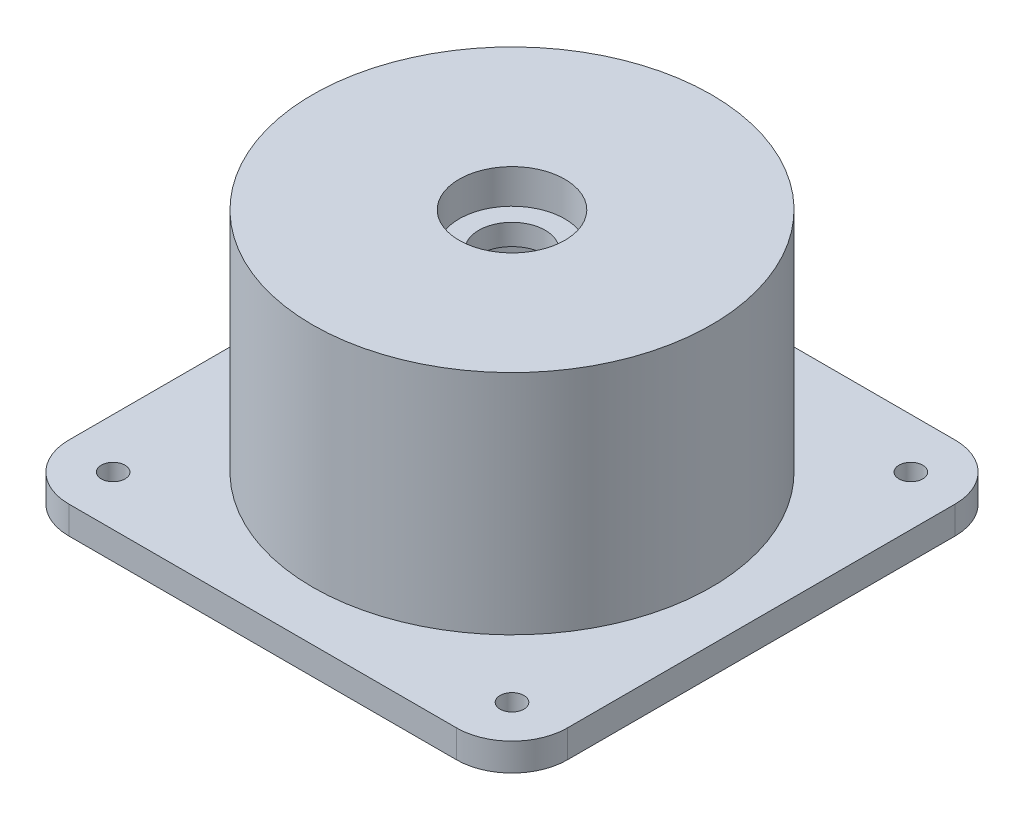
ISO-10303-21;
HEADER;
FILE_DESCRIPTION(('STEP AP214'),'2;1');
FILE_NAME('part.step','',(''),(''),'','','');
FILE_SCHEMA(('AUTOMOTIVE_DESIGN { 1 0 10303 214 1 1 1 1 }'));
ENDSEC;
DATA;
#1=APPLICATION_CONTEXT('core data for automotive mechanical design processes');
#2=APPLICATION_PROTOCOL_DEFINITION('international standard','automotive_design',2000,#1);
#3=PRODUCT_CONTEXT('',#1,'mechanical');
#4=PRODUCT('Part','Part','',(#3));
#5=PRODUCT_RELATED_PRODUCT_CATEGORY('part','',(#4));
#6=PRODUCT_DEFINITION_FORMATION('','',#4);
#7=PRODUCT_DEFINITION_CONTEXT('part definition',#1,'design');
#8=PRODUCT_DEFINITION('design','',#6,#7);
#9=PRODUCT_DEFINITION_SHAPE('','',#8);
#10=(LENGTH_UNIT() NAMED_UNIT(*) SI_UNIT(.MILLI.,.METRE.));
#11=(NAMED_UNIT(*) PLANE_ANGLE_UNIT() SI_UNIT($,.RADIAN.));
#12=(NAMED_UNIT(*) SI_UNIT($,.STERADIAN.) SOLID_ANGLE_UNIT());
#13=UNCERTAINTY_MEASURE_WITH_UNIT(LENGTH_MEASURE(1.E-05),#10,'distance_accuracy_value','');
#14=(GEOMETRIC_REPRESENTATION_CONTEXT(3) GLOBAL_UNCERTAINTY_ASSIGNED_CONTEXT((#13)) GLOBAL_UNIT_ASSIGNED_CONTEXT((#10,
#11,#12)) REPRESENTATION_CONTEXT('',''));
#15=CARTESIAN_POINT('',(0.,0.,0.));
#16=DIRECTION('',(0.,0.,1.));
#17=DIRECTION('',(1.,0.,0.));
#18=AXIS2_PLACEMENT_3D('',#15,#16,#17);
#19=CARTESIAN_POINT('',(-35.,5.,35.));
#20=DIRECTION('',(0.,-1.,0.));
#21=DIRECTION('',(0.,0.,-1.));
#22=AXIS2_PLACEMENT_3D('',#19,#20,#21);
#23=PLANE('',#22);
#24=CARTESIAN_POINT('',(0.,5.,0.));
#25=DIRECTION('',(0.,1.,0.));
#26=DIRECTION('',(0.,0.,1.));
#27=AXIS2_PLACEMENT_3D('',#24,#25,#26);
#28=CIRCLE('',#27,36.);
#29=CARTESIAN_POINT('',(0.,5.,36.));
#30=VERTEX_POINT('',#29);
#31=EDGE_CURVE('E11',#30,#30,#28,.T.);
#32=ORIENTED_EDGE('',*,*,#31,.F.);
#33=EDGE_LOOP('',(#32));
#34=FACE_BOUND('',#33,.T.);
#35=CARTESIAN_POINT('',(-35.,5.,35.));
#36=DIRECTION('',(0.,1.,0.));
#37=DIRECTION('',(0.,0.,-1.));
#38=AXIS2_PLACEMENT_3D('',#35,#36,#37);
#39=CIRCLE('',#38,10.);
#40=CARTESIAN_POINT('',(-45.,5.,35.));
#41=VERTEX_POINT('',#40);
#42=CARTESIAN_POINT('',(-35.,5.,45.));
#43=VERTEX_POINT('',#42);
#44=EDGE_CURVE('E174',#41,#43,#39,.T.);
#45=ORIENTED_EDGE('',*,*,#44,.T.);
#46=DIRECTION('',(1.,0.,0.));
#47=VECTOR('',#46,1.);
#48=CARTESIAN_POINT('',(-35.,5.,45.));
#49=LINE('',#48,#47);
#50=CARTESIAN_POINT('',(35.,5.,45.));
#51=VERTEX_POINT('',#50);
#52=EDGE_CURVE('E107',#43,#51,#49,.T.);
#53=ORIENTED_EDGE('',*,*,#52,.T.);
#54=CARTESIAN_POINT('',(35.,5.,35.));
#55=DIRECTION('',(0.,1.,0.));
#56=DIRECTION('',(0.,0.,1.));
#57=AXIS2_PLACEMENT_3D('',#54,#55,#56);
#58=CIRCLE('',#57,9.99999999999999);
#59=CARTESIAN_POINT('',(45.,5.,35.));
#60=VERTEX_POINT('',#59);
#61=EDGE_CURVE('E215',#51,#60,#58,.T.);
#62=ORIENTED_EDGE('',*,*,#61,.T.);
#63=DIRECTION('',(0.,0.,-1.));
#64=VECTOR('',#63,1.);
#65=CARTESIAN_POINT('',(45.,5.,-35.));
#66=LINE('',#65,#64);
#67=CARTESIAN_POINT('',(45.,5.,-35.));
#68=VERTEX_POINT('',#67);
#69=EDGE_CURVE('E209',#60,#68,#66,.T.);
#70=ORIENTED_EDGE('',*,*,#69,.T.);
#71=CARTESIAN_POINT('',(35.,5.,-35.));
#72=DIRECTION('',(0.,1.,0.));
#73=DIRECTION('',(0.,0.,-1.));
#74=AXIS2_PLACEMENT_3D('',#71,#72,#73);
#75=CIRCLE('',#74,10.);
#76=CARTESIAN_POINT('',(35.,5.,-45.));
#77=VERTEX_POINT('',#76);
#78=EDGE_CURVE('E130',#68,#77,#75,.T.);
#79=ORIENTED_EDGE('',*,*,#78,.T.);
#80=DIRECTION('',(-1.,0.,0.));
#81=VECTOR('',#80,1.);
#82=CARTESIAN_POINT('',(-35.,5.,-45.));
#83=LINE('',#82,#81);
#84=CARTESIAN_POINT('',(-35.,5.,-45.));
#85=VERTEX_POINT('',#84);
#86=EDGE_CURVE('E124',#77,#85,#83,.T.);
#87=ORIENTED_EDGE('',*,*,#86,.T.);
#88=CARTESIAN_POINT('',(-35.,5.,-35.));
#89=DIRECTION('',(0.,1.,0.));
#90=DIRECTION('',(0.,0.,1.));
#91=AXIS2_PLACEMENT_3D('',#88,#89,#90);
#92=CIRCLE('',#91,10.);
#93=CARTESIAN_POINT('',(-45.,5.,-35.));
#94=VERTEX_POINT('',#93);
#95=EDGE_CURVE('E122',#85,#94,#92,.T.);
#96=ORIENTED_EDGE('',*,*,#95,.T.);
#97=DIRECTION('',(0.,0.,1.));
#98=VECTOR('',#97,1.);
#99=CARTESIAN_POINT('',(-45.,5.,-35.));
#100=LINE('',#99,#98);
#101=EDGE_CURVE('E65',#94,#41,#100,.T.);
#102=ORIENTED_EDGE('',*,*,#101,.T.);
#103=EDGE_LOOP('',(#45,#53,#62,#70,#79,#87,#96,#102));
#104=FACE_BOUND('',#103,.T.);
#105=CARTESIAN_POINT('',(-36.,5.,-36.));
#106=DIRECTION('',(0.,1.,0.));
#107=DIRECTION('',(0.,0.,1.));
#108=AXIS2_PLACEMENT_3D('',#105,#106,#107);
#109=CIRCLE('',#108,2.15);
#110=CARTESIAN_POINT('',(-36.,5.,-33.85));
#111=VERTEX_POINT('',#110);
#112=EDGE_CURVE('E152',#111,#111,#109,.T.);
#113=ORIENTED_EDGE('',*,*,#112,.F.);
#114=EDGE_LOOP('',(#113));
#115=FACE_BOUND('',#114,.T.);
#116=CARTESIAN_POINT('',(36.,5.,-36.));
#117=DIRECTION('',(0.,1.,0.));
#118=DIRECTION('',(0.,0.,1.));
#119=AXIS2_PLACEMENT_3D('',#116,#117,#118);
#120=CIRCLE('',#119,2.15);
#121=CARTESIAN_POINT('',(36.,5.,-33.85));
#122=VERTEX_POINT('',#121);
#123=EDGE_CURVE('E228',#122,#122,#120,.T.);
#124=ORIENTED_EDGE('',*,*,#123,.F.);
#125=EDGE_LOOP('',(#124));
#126=FACE_BOUND('',#125,.T.);
#127=CARTESIAN_POINT('',(36.,5.,36.));
#128=DIRECTION('',(0.,1.,0.));
#129=DIRECTION('',(0.,0.,1.));
#130=AXIS2_PLACEMENT_3D('',#127,#128,#129);
#131=CIRCLE('',#130,2.15);
#132=CARTESIAN_POINT('',(36.,5.,38.15));
#133=VERTEX_POINT('',#132);
#134=EDGE_CURVE('E233',#133,#133,#131,.T.);
#135=ORIENTED_EDGE('',*,*,#134,.F.);
#136=EDGE_LOOP('',(#135));
#137=FACE_BOUND('',#136,.T.);
#138=CARTESIAN_POINT('',(-36.,5.,36.));
#139=DIRECTION('',(0.,1.,0.));
#140=DIRECTION('',(0.,0.,1.));
#141=AXIS2_PLACEMENT_3D('',#138,#139,#140);
#142=CIRCLE('',#141,2.15);
#143=CARTESIAN_POINT('',(-36.,5.,38.15));
#144=VERTEX_POINT('',#143);
#145=EDGE_CURVE('E244',#144,#144,#142,.T.);
#146=ORIENTED_EDGE('',*,*,#145,.F.);
#147=EDGE_LOOP('',(#146));
#148=FACE_BOUND('',#147,.T.);
#149=ADVANCED_FACE('F42',(#34,#104,#115,#126,#137,#148),#23,.F.);
#150=CARTESIAN_POINT('',(-35.,0.,35.));
#151=DIRECTION('',(0.,-1.,0.));
#152=DIRECTION('',(0.,0.,-1.));
#153=AXIS2_PLACEMENT_3D('',#150,#151,#152);
#154=PLANE('',#153);
#155=CARTESIAN_POINT('',(0.,0.,0.));
#156=DIRECTION('',(0.,-1.,0.));
#157=DIRECTION('',(0.,0.,-1.));
#158=AXIS2_PLACEMENT_3D('',#155,#156,#157);
#159=CIRCLE('',#158,32.);
#160=CARTESIAN_POINT('',(0.,0.,-32.));
#161=VERTEX_POINT('',#160);
#162=EDGE_CURVE('E266',#161,#161,#159,.T.);
#163=ORIENTED_EDGE('',*,*,#162,.F.);
#164=EDGE_LOOP('',(#163));
#165=FACE_BOUND('',#164,.T.);
#166=CARTESIAN_POINT('',(36.,0.,36.));
#167=DIRECTION('',(0.,1.,0.));
#168=DIRECTION('',(0.,0.,1.));
#169=AXIS2_PLACEMENT_3D('',#166,#167,#168);
#170=CIRCLE('',#169,2.15);
#171=CARTESIAN_POINT('',(36.,0.,38.15));
#172=VERTEX_POINT('',#171);
#173=EDGE_CURVE('E236',#172,#172,#170,.T.);
#174=ORIENTED_EDGE('',*,*,#173,.T.);
#175=EDGE_LOOP('',(#174));
#176=FACE_BOUND('',#175,.T.);
#177=CARTESIAN_POINT('',(-36.,0.,-36.));
#178=DIRECTION('',(0.,1.,0.));
#179=DIRECTION('',(0.,0.,1.));
#180=AXIS2_PLACEMENT_3D('',#177,#178,#179);
#181=CIRCLE('',#180,2.15);
#182=CARTESIAN_POINT('',(-36.,0.,-33.85));
#183=VERTEX_POINT('',#182);
#184=EDGE_CURVE('E225',#183,#183,#181,.T.);
#185=ORIENTED_EDGE('',*,*,#184,.T.);
#186=EDGE_LOOP('',(#185));
#187=FACE_BOUND('',#186,.T.);
#188=CARTESIAN_POINT('',(-35.,0.,35.));
#189=DIRECTION('',(0.,1.,0.));
#190=DIRECTION('',(0.,0.,-1.));
#191=AXIS2_PLACEMENT_3D('',#188,#189,#190);
#192=CIRCLE('',#191,10.);
#193=CARTESIAN_POINT('',(-45.,0.,35.));
#194=VERTEX_POINT('',#193);
#195=CARTESIAN_POINT('',(-35.,0.,45.));
#196=VERTEX_POINT('',#195);
#197=EDGE_CURVE('E149',#194,#196,#192,.T.);
#198=ORIENTED_EDGE('',*,*,#197,.F.);
#199=DIRECTION('',(0.,0.,1.));
#200=VECTOR('',#199,1.);
#201=CARTESIAN_POINT('',(-45.,0.,-35.));
#202=LINE('',#201,#200);
#203=CARTESIAN_POINT('',(-45.,0.,-35.));
#204=VERTEX_POINT('',#203);
#205=EDGE_CURVE('E97',#204,#194,#202,.T.);
#206=ORIENTED_EDGE('',*,*,#205,.F.);
#207=CARTESIAN_POINT('',(-35.,0.,-35.));
#208=DIRECTION('',(0.,1.,0.));
#209=DIRECTION('',(0.,0.,1.));
#210=AXIS2_PLACEMENT_3D('',#207,#208,#209);
#211=CIRCLE('',#210,10.);
#212=CARTESIAN_POINT('',(-35.,0.,-45.));
#213=VERTEX_POINT('',#212);
#214=EDGE_CURVE('E91',#213,#204,#211,.T.);
#215=ORIENTED_EDGE('',*,*,#214,.F.);
#216=DIRECTION('',(-1.,0.,0.));
#217=VECTOR('',#216,1.);
#218=CARTESIAN_POINT('',(-35.,0.,-45.));
#219=LINE('',#218,#217);
#220=CARTESIAN_POINT('',(35.,0.,-45.));
#221=VERTEX_POINT('',#220);
#222=EDGE_CURVE('E139',#221,#213,#219,.T.);
#223=ORIENTED_EDGE('',*,*,#222,.F.);
#224=CARTESIAN_POINT('',(35.,0.,-35.));
#225=DIRECTION('',(0.,1.,0.));
#226=DIRECTION('',(0.,0.,-1.));
#227=AXIS2_PLACEMENT_3D('',#224,#225,#226);
#228=CIRCLE('',#227,10.);
#229=CARTESIAN_POINT('',(45.,0.,-35.));
#230=VERTEX_POINT('',#229);
#231=EDGE_CURVE('E162',#230,#221,#228,.T.);
#232=ORIENTED_EDGE('',*,*,#231,.F.);
#233=DIRECTION('',(0.,0.,-1.));
#234=VECTOR('',#233,1.);
#235=CARTESIAN_POINT('',(45.,0.,-35.));
#236=LINE('',#235,#234);
#237=CARTESIAN_POINT('',(45.,0.,35.));
#238=VERTEX_POINT('',#237);
#239=EDGE_CURVE('E159',#238,#230,#236,.T.);
#240=ORIENTED_EDGE('',*,*,#239,.F.);
#241=CARTESIAN_POINT('',(35.,0.,35.));
#242=DIRECTION('',(0.,1.,0.));
#243=DIRECTION('',(0.,0.,1.));
#244=AXIS2_PLACEMENT_3D('',#241,#242,#243);
#245=CIRCLE('',#244,9.99999999999999);
#246=CARTESIAN_POINT('',(35.,0.,45.));
#247=VERTEX_POINT('',#246);
#248=EDGE_CURVE('E160',#247,#238,#245,.T.);
#249=ORIENTED_EDGE('',*,*,#248,.F.);
#250=DIRECTION('',(1.,0.,0.));
#251=VECTOR('',#250,1.);
#252=CARTESIAN_POINT('',(-35.,0.,45.));
#253=LINE('',#252,#251);
#254=EDGE_CURVE('E153',#196,#247,#253,.T.);
#255=ORIENTED_EDGE('',*,*,#254,.F.);
#256=EDGE_LOOP('',(#198,#206,#215,#223,#232,#240,#249,#255));
#257=FACE_BOUND('',#256,.T.);
#258=CARTESIAN_POINT('',(36.,0.,-36.));
#259=DIRECTION('',(0.,1.,0.));
#260=DIRECTION('',(0.,0.,1.));
#261=AXIS2_PLACEMENT_3D('',#258,#259,#260);
#262=CIRCLE('',#261,2.15);
#263=CARTESIAN_POINT('',(36.,0.,-33.85));
#264=VERTEX_POINT('',#263);
#265=EDGE_CURVE('E226',#264,#264,#262,.T.);
#266=ORIENTED_EDGE('',*,*,#265,.T.);
#267=EDGE_LOOP('',(#266));
#268=FACE_BOUND('',#267,.T.);
#269=CARTESIAN_POINT('',(-36.,0.,36.));
#270=DIRECTION('',(0.,1.,0.));
#271=DIRECTION('',(0.,0.,1.));
#272=AXIS2_PLACEMENT_3D('',#269,#270,#271);
#273=CIRCLE('',#272,2.15);
#274=CARTESIAN_POINT('',(-36.,0.,38.15));
#275=VERTEX_POINT('',#274);
#276=EDGE_CURVE('E249',#275,#275,#273,.T.);
#277=ORIENTED_EDGE('',*,*,#276,.T.);
#278=EDGE_LOOP('',(#277));
#279=FACE_BOUND('',#278,.T.);
#280=ADVANCED_FACE('F197',(#165,#176,#187,#257,#268,#279),#154,.T.);
#281=CARTESIAN_POINT('',(-35.,5.,35.));
#282=DIRECTION('',(0.,-1.,0.));
#283=DIRECTION('',(0.,0.,-1.));
#284=AXIS2_PLACEMENT_3D('',#281,#282,#283);
#285=CYLINDRICAL_SURFACE('',#284,10.);
#286=ORIENTED_EDGE('',*,*,#197,.T.);
#287=DIRECTION('',(0.,-1.,0.));
#288=VECTOR('',#287,1.);
#289=CARTESIAN_POINT('',(-35.,5.,45.));
#290=LINE('',#289,#288);
#291=EDGE_CURVE('E54',#43,#196,#290,.T.);
#292=ORIENTED_EDGE('',*,*,#291,.F.);
#293=ORIENTED_EDGE('',*,*,#44,.F.);
#294=DIRECTION('',(0.,-1.,0.));
#295=VECTOR('',#294,1.);
#296=CARTESIAN_POINT('',(-45.,5.,35.));
#297=LINE('',#296,#295);
#298=EDGE_CURVE('E144',#41,#194,#297,.T.);
#299=ORIENTED_EDGE('',*,*,#298,.T.);
#300=EDGE_LOOP('',(#286,#292,#293,#299));
#301=FACE_BOUND('',#300,.T.);
#302=ADVANCED_FACE('F46',(#301),#285,.T.);
#303=CARTESIAN_POINT('',(-35.,5.,45.));
#304=DIRECTION('',(0.,0.,-1.));
#305=DIRECTION('',(-1.,0.,0.));
#306=AXIS2_PLACEMENT_3D('',#303,#304,#305);
#307=PLANE('',#306);
#308=ORIENTED_EDGE('',*,*,#254,.T.);
#309=DIRECTION('',(0.,-1.,0.));
#310=VECTOR('',#309,1.);
#311=CARTESIAN_POINT('',(35.,5.,45.));
#312=LINE('',#311,#310);
#313=EDGE_CURVE('E189',#51,#247,#312,.T.);
#314=ORIENTED_EDGE('',*,*,#313,.F.);
#315=ORIENTED_EDGE('',*,*,#52,.F.);
#316=ORIENTED_EDGE('',*,*,#291,.T.);
#317=EDGE_LOOP('',(#308,#314,#315,#316));
#318=FACE_BOUND('',#317,.T.);
#319=ADVANCED_FACE('F191',(#318),#307,.F.);
#320=CARTESIAN_POINT('',(35.,5.,35.));
#321=DIRECTION('',(0.,-1.,0.));
#322=DIRECTION('',(0.,0.,-1.));
#323=AXIS2_PLACEMENT_3D('',#320,#321,#322);
#324=CYLINDRICAL_SURFACE('',#323,9.99999999999999);
#325=ORIENTED_EDGE('',*,*,#248,.T.);
#326=DIRECTION('',(0.,-1.,0.));
#327=VECTOR('',#326,1.);
#328=CARTESIAN_POINT('',(45.,5.,35.));
#329=LINE('',#328,#327);
#330=EDGE_CURVE('E181',#60,#238,#329,.T.);
#331=ORIENTED_EDGE('',*,*,#330,.F.);
#332=ORIENTED_EDGE('',*,*,#61,.F.);
#333=ORIENTED_EDGE('',*,*,#313,.T.);
#334=EDGE_LOOP('',(#325,#331,#332,#333));
#335=FACE_BOUND('',#334,.T.);
#336=ADVANCED_FACE('F204',(#335),#324,.T.);
#337=CARTESIAN_POINT('',(45.,5.,-35.));
#338=DIRECTION('',(-1.,0.,0.));
#339=DIRECTION('',(0.,0.,1.));
#340=AXIS2_PLACEMENT_3D('',#337,#338,#339);
#341=PLANE('',#340);
#342=ORIENTED_EDGE('',*,*,#239,.T.);
#343=DIRECTION('',(0.,-1.,0.));
#344=VECTOR('',#343,1.);
#345=CARTESIAN_POINT('',(45.,5.,-35.));
#346=LINE('',#345,#344);
#347=EDGE_CURVE('E178',#68,#230,#346,.T.);
#348=ORIENTED_EDGE('',*,*,#347,.F.);
#349=ORIENTED_EDGE('',*,*,#69,.F.);
#350=ORIENTED_EDGE('',*,*,#330,.T.);
#351=EDGE_LOOP('',(#342,#348,#349,#350));
#352=FACE_BOUND('',#351,.T.);
#353=ADVANCED_FACE('F208',(#352),#341,.F.);
#354=CARTESIAN_POINT('',(35.,5.,-35.));
#355=DIRECTION('',(0.,-1.,0.));
#356=DIRECTION('',(0.,0.,-1.));
#357=AXIS2_PLACEMENT_3D('',#354,#355,#356);
#358=CYLINDRICAL_SURFACE('',#357,10.);
#359=ORIENTED_EDGE('',*,*,#231,.T.);
#360=DIRECTION('',(0.,-1.,0.));
#361=VECTOR('',#360,1.);
#362=CARTESIAN_POINT('',(35.,5.,-45.));
#363=LINE('',#362,#361);
#364=EDGE_CURVE('E140',#77,#221,#363,.T.);
#365=ORIENTED_EDGE('',*,*,#364,.F.);
#366=ORIENTED_EDGE('',*,*,#78,.F.);
#367=ORIENTED_EDGE('',*,*,#347,.T.);
#368=EDGE_LOOP('',(#359,#365,#366,#367));
#369=FACE_BOUND('',#368,.T.);
#370=ADVANCED_FACE('F332',(#369),#358,.T.);
#371=CARTESIAN_POINT('',(-35.,5.,-45.));
#372=DIRECTION('',(0.,0.,1.));
#373=DIRECTION('',(1.,0.,0.));
#374=AXIS2_PLACEMENT_3D('',#371,#372,#373);
#375=PLANE('',#374);
#376=ORIENTED_EDGE('',*,*,#222,.T.);
#377=DIRECTION('',(0.,-1.,0.));
#378=VECTOR('',#377,1.);
#379=CARTESIAN_POINT('',(-35.,5.,-45.));
#380=LINE('',#379,#378);
#381=EDGE_CURVE('E132',#85,#213,#380,.T.);
#382=ORIENTED_EDGE('',*,*,#381,.F.);
#383=ORIENTED_EDGE('',*,*,#86,.F.);
#384=ORIENTED_EDGE('',*,*,#364,.T.);
#385=EDGE_LOOP('',(#376,#382,#383,#384));
#386=FACE_BOUND('',#385,.T.);
#387=ADVANCED_FACE('F135',(#386),#375,.F.);
#388=CARTESIAN_POINT('',(-35.,5.,-35.));
#389=DIRECTION('',(0.,-1.,0.));
#390=DIRECTION('',(0.,0.,-1.));
#391=AXIS2_PLACEMENT_3D('',#388,#389,#390);
#392=CYLINDRICAL_SURFACE('',#391,10.);
#393=ORIENTED_EDGE('',*,*,#214,.T.);
#394=DIRECTION('',(0.,-1.,0.));
#395=VECTOR('',#394,1.);
#396=CARTESIAN_POINT('',(-45.,5.,-35.));
#397=LINE('',#396,#395);
#398=EDGE_CURVE('E138',#94,#204,#397,.T.);
#399=ORIENTED_EDGE('',*,*,#398,.F.);
#400=ORIENTED_EDGE('',*,*,#95,.F.);
#401=ORIENTED_EDGE('',*,*,#381,.T.);
#402=EDGE_LOOP('',(#393,#399,#400,#401));
#403=FACE_BOUND('',#402,.T.);
#404=ADVANCED_FACE('F143',(#403),#392,.T.);
#405=CARTESIAN_POINT('',(-45.,5.,-35.));
#406=DIRECTION('',(1.,0.,0.));
#407=DIRECTION('',(0.,0.,-1.));
#408=AXIS2_PLACEMENT_3D('',#405,#406,#407);
#409=PLANE('',#408);
#410=ORIENTED_EDGE('',*,*,#205,.T.);
#411=ORIENTED_EDGE('',*,*,#298,.F.);
#412=ORIENTED_EDGE('',*,*,#101,.F.);
#413=ORIENTED_EDGE('',*,*,#398,.T.);
#414=EDGE_LOOP('',(#410,#411,#412,#413));
#415=FACE_BOUND('',#414,.T.);
#416=ADVANCED_FACE('F307',(#415),#409,.F.);
#417=CARTESIAN_POINT('',(-36.,5.,-36.));
#418=DIRECTION('',(0.,-1.,0.));
#419=DIRECTION('',(0.,0.,-1.));
#420=AXIS2_PLACEMENT_3D('',#417,#418,#419);
#421=CYLINDRICAL_SURFACE('',#420,2.15);
#422=ORIENTED_EDGE('',*,*,#112,.T.);
#423=EDGE_LOOP('',(#422));
#424=FACE_BOUND('',#423,.T.);
#425=ORIENTED_EDGE('',*,*,#184,.F.);
#426=EDGE_LOOP('',(#425));
#427=FACE_BOUND('',#426,.T.);
#428=ADVANCED_FACE('F303',(#424,#427),#421,.F.);
#429=CARTESIAN_POINT('',(36.,5.,-36.));
#430=DIRECTION('',(0.,-1.,0.));
#431=DIRECTION('',(0.,0.,-1.));
#432=AXIS2_PLACEMENT_3D('',#429,#430,#431);
#433=CYLINDRICAL_SURFACE('',#432,2.15);
#434=ORIENTED_EDGE('',*,*,#123,.T.);
#435=EDGE_LOOP('',(#434));
#436=FACE_BOUND('',#435,.T.);
#437=ORIENTED_EDGE('',*,*,#265,.F.);
#438=EDGE_LOOP('',(#437));
#439=FACE_BOUND('',#438,.T.);
#440=ADVANCED_FACE('F308',(#436,#439),#433,.F.);
#441=CARTESIAN_POINT('',(36.,5.,36.));
#442=DIRECTION('',(0.,-1.,0.));
#443=DIRECTION('',(0.,0.,-1.));
#444=AXIS2_PLACEMENT_3D('',#441,#442,#443);
#445=CYLINDRICAL_SURFACE('',#444,2.15);
#446=ORIENTED_EDGE('',*,*,#134,.T.);
#447=EDGE_LOOP('',(#446));
#448=FACE_BOUND('',#447,.T.);
#449=ORIENTED_EDGE('',*,*,#173,.F.);
#450=EDGE_LOOP('',(#449));
#451=FACE_BOUND('',#450,.T.);
#452=ADVANCED_FACE('F314',(#448,#451),#445,.F.);
#453=CARTESIAN_POINT('',(-36.,5.,36.));
#454=DIRECTION('',(0.,-1.,0.));
#455=DIRECTION('',(0.,0.,-1.));
#456=AXIS2_PLACEMENT_3D('',#453,#454,#455);
#457=CYLINDRICAL_SURFACE('',#456,2.15);
#458=ORIENTED_EDGE('',*,*,#145,.T.);
#459=EDGE_LOOP('',(#458));
#460=FACE_BOUND('',#459,.T.);
#461=ORIENTED_EDGE('',*,*,#276,.F.);
#462=EDGE_LOOP('',(#461));
#463=FACE_BOUND('',#462,.T.);
#464=ADVANCED_FACE('F407',(#460,#463),#457,.F.);
#465=CARTESIAN_POINT('',(0.,46.,0.));
#466=DIRECTION('',(0.,-1.,0.));
#467=DIRECTION('',(0.,0.,-1.));
#468=AXIS2_PLACEMENT_3D('',#465,#466,#467);
#469=CYLINDRICAL_SURFACE('',#468,36.);
#470=CARTESIAN_POINT('',(0.,46.,0.));
#471=DIRECTION('',(0.,1.,0.));
#472=DIRECTION('',(0.,0.,1.));
#473=AXIS2_PLACEMENT_3D('',#470,#471,#472);
#474=CIRCLE('',#473,36.);
#475=CARTESIAN_POINT('',(0.,46.,36.));
#476=VERTEX_POINT('',#475);
#477=EDGE_CURVE('E247',#476,#476,#474,.T.);
#478=ORIENTED_EDGE('',*,*,#477,.F.);
#479=EDGE_LOOP('',(#478));
#480=FACE_BOUND('',#479,.T.);
#481=ORIENTED_EDGE('',*,*,#31,.T.);
#482=EDGE_LOOP('',(#481));
#483=FACE_BOUND('',#482,.T.);
#484=ADVANCED_FACE('F417',(#480,#483),#469,.T.);
#485=CARTESIAN_POINT('',(0.,46.,0.));
#486=DIRECTION('',(0.,1.,0.));
#487=DIRECTION('',(0.,0.,1.));
#488=AXIS2_PLACEMENT_3D('',#485,#486,#487);
#489=PLANE('',#488);
#490=CARTESIAN_POINT('',(0.,46.,0.));
#491=DIRECTION('',(0.,1.,0.));
#492=DIRECTION('',(0.,0.,1.));
#493=AXIS2_PLACEMENT_3D('',#490,#491,#492);
#494=CIRCLE('',#493,9.55);
#495=CARTESIAN_POINT('',(0.,46.,9.55));
#496=VERTEX_POINT('',#495);
#497=EDGE_CURVE('E256',#496,#496,#494,.T.);
#498=ORIENTED_EDGE('',*,*,#497,.F.);
#499=EDGE_LOOP('',(#498));
#500=FACE_BOUND('',#499,.T.);
#501=ORIENTED_EDGE('',*,*,#477,.T.);
#502=EDGE_LOOP('',(#501));
#503=FACE_BOUND('',#502,.T.);
#504=ADVANCED_FACE('F426',(#500,#503),#489,.T.);
#505=CARTESIAN_POINT('',(0.,39.8,0.));
#506=DIRECTION('',(0.,1.,0.));
#507=DIRECTION('',(0.,0.,1.));
#508=AXIS2_PLACEMENT_3D('',#505,#506,#507);
#509=CYLINDRICAL_SURFACE('',#508,9.55);
#510=CARTESIAN_POINT('',(0.,39.8,0.));
#511=DIRECTION('',(0.,1.,0.));
#512=DIRECTION('',(0.,0.,1.));
#513=AXIS2_PLACEMENT_3D('',#510,#511,#512);
#514=CIRCLE('',#513,9.55);
#515=CARTESIAN_POINT('',(0.,39.8,9.55));
#516=VERTEX_POINT('',#515);
#517=EDGE_CURVE('E260',#516,#516,#514,.T.);
#518=CARTESIAN_POINT('',(0.,39.8,9.55));
#519=CARTESIAN_POINT('',(0.,39.8645833333333,9.55));
#520=CARTESIAN_POINT('',(0.,39.9291666666667,9.55));
#521=CARTESIAN_POINT('',(0.,40.0583333333333,9.55));
#522=CARTESIAN_POINT('',(0.,40.1229166666667,9.55));
#523=CARTESIAN_POINT('',(0.,40.2520833333333,9.55));
#524=CARTESIAN_POINT('',(0.,40.3166666666667,9.55));
#525=CARTESIAN_POINT('',(0.,40.4458333333333,9.55));
#526=CARTESIAN_POINT('',(0.,40.5104166666667,9.55));
#527=CARTESIAN_POINT('',(0.,40.6395833333333,9.55));
#528=CARTESIAN_POINT('',(0.,40.7041666666667,9.55));
#529=CARTESIAN_POINT('',(0.,40.8333333333333,9.55));
#530=CARTESIAN_POINT('',(0.,40.8979166666667,9.55));
#531=CARTESIAN_POINT('',(0.,41.0270833333333,9.55));
#532=CARTESIAN_POINT('',(0.,41.0916666666667,9.55));
#533=CARTESIAN_POINT('',(0.,41.2208333333333,9.55));
#534=CARTESIAN_POINT('',(0.,41.2854166666667,9.55));
#535=CARTESIAN_POINT('',(0.,41.4145833333333,9.55));
#536=CARTESIAN_POINT('',(0.,41.4791666666667,9.55));
#537=CARTESIAN_POINT('',(0.,41.6083333333333,9.55));
#538=CARTESIAN_POINT('',(0.,41.6729166666667,9.55));
#539=CARTESIAN_POINT('',(0.,41.8020833333333,9.55));
#540=CARTESIAN_POINT('',(0.,41.8666666666667,9.55));
#541=CARTESIAN_POINT('',(0.,41.9958333333333,9.55));
#542=CARTESIAN_POINT('',(0.,42.0604166666667,9.55));
#543=CARTESIAN_POINT('',(0.,42.1895833333333,9.55));
#544=CARTESIAN_POINT('',(0.,42.2541666666667,9.55));
#545=CARTESIAN_POINT('',(0.,42.3833333333333,9.55));
#546=CARTESIAN_POINT('',(0.,42.4479166666667,9.55));
#547=CARTESIAN_POINT('',(0.,42.5770833333333,9.55));
#548=CARTESIAN_POINT('',(0.,42.6416666666667,9.55));
#549=CARTESIAN_POINT('',(0.,42.7708333333333,9.55));
#550=CARTESIAN_POINT('',(0.,42.8354166666667,9.55));
#551=CARTESIAN_POINT('',(0.,42.9645833333333,9.55));
#552=CARTESIAN_POINT('',(0.,43.0291666666667,9.55));
#553=CARTESIAN_POINT('',(0.,43.1583333333333,9.55));
#554=CARTESIAN_POINT('',(0.,43.2229166666667,9.55));
#555=CARTESIAN_POINT('',(0.,43.3520833333333,9.55));
#556=CARTESIAN_POINT('',(0.,43.4166666666667,9.55));
#557=CARTESIAN_POINT('',(0.,43.5458333333333,9.55));
#558=CARTESIAN_POINT('',(0.,43.6104166666667,9.55));
#559=CARTESIAN_POINT('',(0.,43.7395833333333,9.55));
#560=CARTESIAN_POINT('',(0.,43.8041666666667,9.55));
#561=CARTESIAN_POINT('',(0.,43.9333333333333,9.55));
#562=CARTESIAN_POINT('',(0.,43.9979166666667,9.55));
#563=CARTESIAN_POINT('',(0.,44.1270833333333,9.55));
#564=CARTESIAN_POINT('',(0.,44.1916666666667,9.55));
#565=CARTESIAN_POINT('',(0.,44.3208333333333,9.55));
#566=CARTESIAN_POINT('',(0.,44.3854166666667,9.55));
#567=CARTESIAN_POINT('',(0.,44.5145833333333,9.55));
#568=CARTESIAN_POINT('',(0.,44.5791666666667,9.55));
#569=CARTESIAN_POINT('',(0.,44.7083333333333,9.55));
#570=CARTESIAN_POINT('',(0.,44.7729166666667,9.55));
#571=CARTESIAN_POINT('',(0.,44.9020833333333,9.55));
#572=CARTESIAN_POINT('',(0.,44.9666666666667,9.55));
#573=CARTESIAN_POINT('',(0.,45.0958333333333,9.55));
#574=CARTESIAN_POINT('',(0.,45.1604166666667,9.55));
#575=CARTESIAN_POINT('',(0.,45.2895833333333,9.55));
#576=CARTESIAN_POINT('',(0.,45.3541666666667,9.55));
#577=CARTESIAN_POINT('',(0.,45.4833333333333,9.55));
#578=CARTESIAN_POINT('',(0.,45.5479166666667,9.55));
#579=CARTESIAN_POINT('',(0.,45.6770833333333,9.55));
#580=CARTESIAN_POINT('',(0.,45.7416666666667,9.55));
#581=CARTESIAN_POINT('',(0.,45.8708333333333,9.55));
#582=CARTESIAN_POINT('',(0.,45.9354166666667,9.55));
#583=CARTESIAN_POINT('',(0.,46.,9.55));
#584=B_SPLINE_CURVE_WITH_KNOTS('',3,(#518,#519,#520,#521,#522,#523,#524,#525,#526,#527,#528,
#529,#530,#531,#532,#533,#534,#535,#536,#537,#538,#539,#540,#541,#542,#543,#544,#545,#546,#547,
#548,#549,#550,#551,#552,#553,#554,#555,#556,#557,#558,#559,#560,#561,#562,#563,#564,#565,#566,
#567,#568,#569,#570,#571,#572,#573,#574,#575,#576,#577,#578,#579,#580,#581,#582,#583),
.UNSPECIFIED.,.F.,.F.,(4,2,2,2,2,2,2,2,2,2,2,2,2,2,2,2,2,2,2,2,2,2,2,2,2,2,2,2,2,2,2,2,4),(0.,
0.193750000000006,0.387500000000006,0.581250000000005,0.775000000000005,0.968750000000004,
1.1625,1.35625,1.55,1.74375,1.9375,2.13125,2.325,2.51875,2.7125,2.90625,3.1,3.29375000000001,
3.4875,3.68125,3.875,4.06875,4.2625,4.45625,4.65,4.84375,5.0375,5.23125,5.425,5.61875,5.8125,
6.00625,6.2),.UNSPECIFIED.);
#585=EDGE_CURVE('BSEAM436',#516,#496,#584,.T.);
#586=ORIENTED_EDGE('',*,*,#517,.F.);
#587=ORIENTED_EDGE('',*,*,#497,.T.);
#588=ORIENTED_EDGE('',*,*,#585,.T.);
#589=ORIENTED_EDGE('',*,*,#585,.F.);
#590=EDGE_LOOP('',(#586,#588,#587,#589));
#591=FACE_BOUND('',#590,.T.);
#592=ADVANCED_FACE('F436',(#591),#509,.F.);
#593=CARTESIAN_POINT('',(0.,39.8,0.));
#594=DIRECTION('',(0.,1.,0.));
#595=DIRECTION('',(0.,0.,1.));
#596=AXIS2_PLACEMENT_3D('',#593,#594,#595);
#597=PLANE('',#596);
#598=CARTESIAN_POINT('',(0.,39.8,0.));
#599=DIRECTION('',(0.,1.,0.));
#600=DIRECTION('',(0.,0.,1.));
#601=AXIS2_PLACEMENT_3D('',#598,#599,#600);
#602=CIRCLE('',#601,6.);
#603=CARTESIAN_POINT('',(0.,39.8,6.));
#604=VERTEX_POINT('',#603);
#605=EDGE_CURVE('E272',#604,#604,#602,.T.);
#606=ORIENTED_EDGE('',*,*,#605,.F.);
#607=EDGE_LOOP('',(#606));
#608=FACE_BOUND('',#607,.T.);
#609=ORIENTED_EDGE('',*,*,#517,.T.);
#610=EDGE_LOOP('',(#609));
#611=FACE_BOUND('',#610,.T.);
#612=ADVANCED_FACE('F291',(#608,#611),#597,.T.);
#613=CARTESIAN_POINT('',(0.,36.,0.));
#614=DIRECTION('',(0.,-1.,0.));
#615=DIRECTION('',(0.,0.,-1.));
#616=AXIS2_PLACEMENT_3D('',#613,#614,#615);
#617=CYLINDRICAL_SURFACE('',#616,32.);
#618=CARTESIAN_POINT('',(0.,36.,0.));
#619=DIRECTION('',(0.,-1.,0.));
#620=DIRECTION('',(0.,0.,-1.));
#621=AXIS2_PLACEMENT_3D('',#618,#619,#620);
#622=CIRCLE('',#621,32.);
#623=CARTESIAN_POINT('',(0.,36.,-32.));
#624=VERTEX_POINT('',#623);
#625=EDGE_CURVE('E265',#624,#624,#622,.T.);
#626=ORIENTED_EDGE('',*,*,#625,.F.);
#627=EDGE_LOOP('',(#626));
#628=FACE_BOUND('',#627,.T.);
#629=ORIENTED_EDGE('',*,*,#162,.T.);
#630=EDGE_LOOP('',(#629));
#631=FACE_BOUND('',#630,.T.);
#632=ADVANCED_FACE('F286',(#628,#631),#617,.F.);
#633=CARTESIAN_POINT('',(0.,36.,0.));
#634=DIRECTION('',(0.,-1.,0.));
#635=DIRECTION('',(0.,0.,-1.));
#636=AXIS2_PLACEMENT_3D('',#633,#634,#635);
#637=PLANE('',#636);
#638=CARTESIAN_POINT('',(0.,36.,0.));
#639=DIRECTION('',(0.,-1.,0.));
#640=DIRECTION('',(0.,0.,-1.));
#641=AXIS2_PLACEMENT_3D('',#638,#639,#640);
#642=CIRCLE('',#641,6.);
#643=CARTESIAN_POINT('',(0.,36.,-6.));
#644=VERTEX_POINT('',#643);
#645=EDGE_CURVE('E48',#644,#644,#642,.T.);
#646=ORIENTED_EDGE('',*,*,#645,.F.);
#647=EDGE_LOOP('',(#646));
#648=FACE_BOUND('',#647,.T.);
#649=ORIENTED_EDGE('',*,*,#625,.T.);
#650=EDGE_LOOP('',(#649));
#651=FACE_BOUND('',#650,.T.);
#652=ADVANCED_FACE('F285',(#648,#651),#637,.T.);
#653=CARTESIAN_POINT('',(0.,0.,0.));
#654=DIRECTION('',(0.,1.,0.));
#655=DIRECTION('',(0.,0.,1.));
#656=AXIS2_PLACEMENT_3D('',#653,#654,#655);
#657=CYLINDRICAL_SURFACE('',#656,6.);
#658=ORIENTED_EDGE('',*,*,#645,.T.);
#659=EDGE_LOOP('',(#658));
#660=FACE_BOUND('',#659,.T.);
#661=ORIENTED_EDGE('',*,*,#605,.T.);
#662=EDGE_LOOP('',(#661));
#663=FACE_BOUND('',#662,.T.);
#664=ADVANCED_FACE('F284',(#660,#663),#657,.F.);
#665=CLOSED_SHELL('',(#149,#280,#302,#319,#336,#353,#370,#387,#404,#416,#428,#440,#452,#464,
#484,#504,#592,#612,#632,#652,#664));
#666=MANIFOLD_SOLID_BREP('B2',#665);
#667=ADVANCED_BREP_SHAPE_REPRESENTATION('',(#18,#666),#14);
#668=SHAPE_DEFINITION_REPRESENTATION(#9,#667);
ENDSEC;
END-ISO-10303-21;
